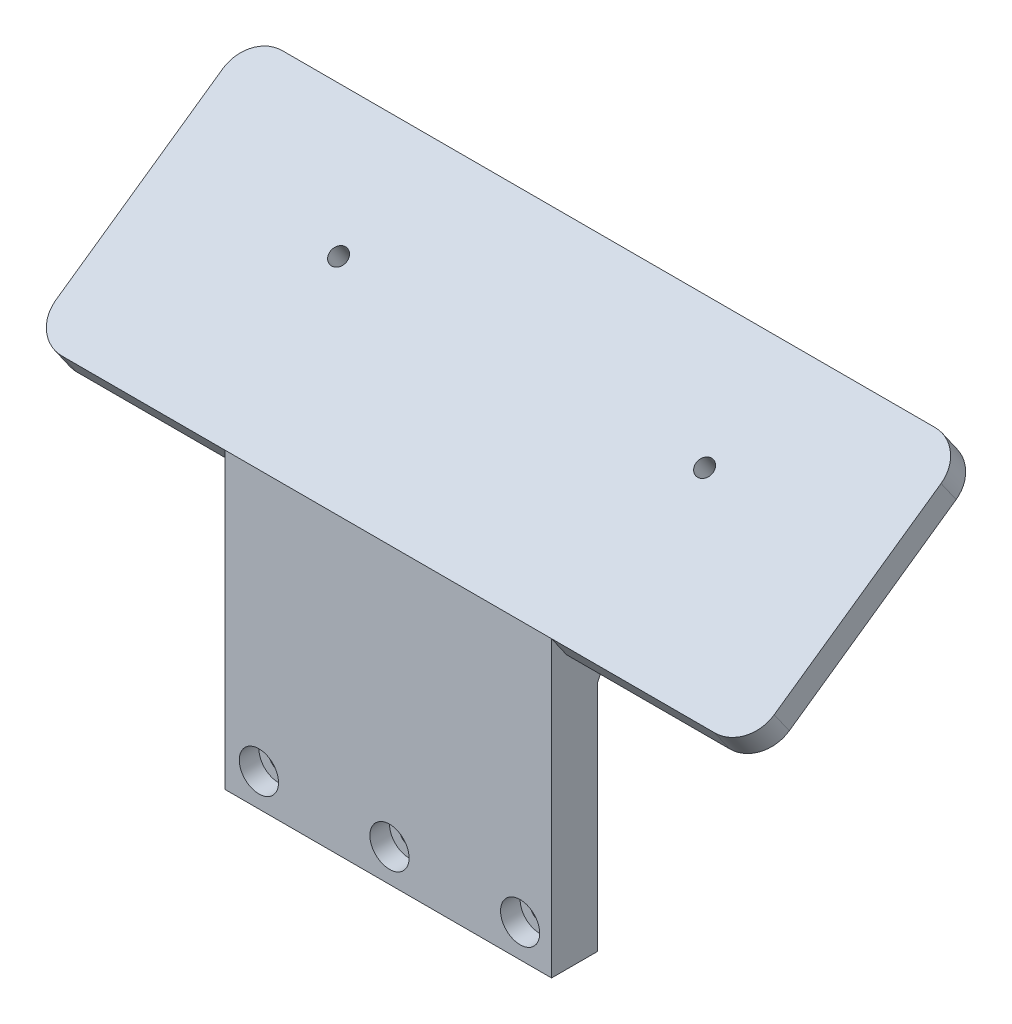
ISO-10303-21;
HEADER;
FILE_DESCRIPTION(('STEP AP214'),'2;1');
FILE_NAME('part.step','',(''),(''),'','','');
FILE_SCHEMA(('AUTOMOTIVE_DESIGN { 1 0 10303 214 1 1 1 1 }'));
ENDSEC;
DATA;
#1=APPLICATION_CONTEXT('core data for automotive mechanical design processes');
#2=APPLICATION_PROTOCOL_DEFINITION('international standard','automotive_design',2000,#1);
#3=PRODUCT_CONTEXT('',#1,'mechanical');
#4=PRODUCT('Part','Part','',(#3));
#5=PRODUCT_RELATED_PRODUCT_CATEGORY('part','',(#4));
#6=PRODUCT_DEFINITION_FORMATION('','',#4);
#7=PRODUCT_DEFINITION_CONTEXT('part definition',#1,'design');
#8=PRODUCT_DEFINITION('design','',#6,#7);
#9=PRODUCT_DEFINITION_SHAPE('','',#8);
#10=(LENGTH_UNIT() NAMED_UNIT(*) SI_UNIT(.MILLI.,.METRE.));
#11=(NAMED_UNIT(*) PLANE_ANGLE_UNIT() SI_UNIT($,.RADIAN.));
#12=(NAMED_UNIT(*) SI_UNIT($,.STERADIAN.) SOLID_ANGLE_UNIT());
#13=UNCERTAINTY_MEASURE_WITH_UNIT(LENGTH_MEASURE(1.E-05),#10,'distance_accuracy_value','');
#14=(GEOMETRIC_REPRESENTATION_CONTEXT(3) GLOBAL_UNCERTAINTY_ASSIGNED_CONTEXT((#13)) GLOBAL_UNIT_ASSIGNED_CONTEXT((#10,
#11,#12)) REPRESENTATION_CONTEXT('',''));
#15=CARTESIAN_POINT('',(0.,0.,0.));
#16=DIRECTION('',(0.,0.,1.));
#17=DIRECTION('',(1.,0.,0.));
#18=AXIS2_PLACEMENT_3D('',#15,#16,#17);
#19=CARTESIAN_POINT('',(0.,35.7869859354237,25.0583173217886));
#20=DIRECTION('',(0.,0.819152044288991,0.573576436351047));
#21=DIRECTION('',(0.,-0.573576436351047,0.819152044288991));
#22=AXIS2_PLACEMENT_3D('',#19,#20,#21);
#23=PLANE('',#22);
#24=CARTESIAN_POINT('',(-71.3751766055046,55.8736511521487,-3.62841356957319));
#25=DIRECTION('',(0.,0.819152044288991,0.573576436351047));
#26=DIRECTION('',(0.,-0.573576436351047,0.819152044288991));
#27=AXIS2_PLACEMENT_3D('',#24,#25,#26);
#28=CIRCLE('',#27,1.29999999999999);
#29=CARTESIAN_POINT('',(-71.3751766055046,55.1280017848923,-2.56351591199751));
#30=VERTEX_POINT('',#29);
#31=EDGE_CURVE('E177',#30,#30,#28,.T.);
#32=ORIENTED_EDGE('',*,*,#31,.T.);
#33=EDGE_LOOP('',(#32));
#34=FACE_BOUND('',#33,.T.);
#35=CARTESIAN_POINT('',(-15.3251766055046,55.8736511521487,-3.6284135695732));
#36=DIRECTION('',(0.,0.819152044288991,0.573576436351047));
#37=DIRECTION('',(0.,-0.573576436351047,0.819152044288991));
#38=AXIS2_PLACEMENT_3D('',#35,#36,#37);
#39=CIRCLE('',#38,1.3);
#40=CARTESIAN_POINT('',(-15.3251766055046,55.1280017848924,-2.56351591199751));
#41=VERTEX_POINT('',#40);
#42=EDGE_CURVE('E174',#41,#41,#39,.T.);
#43=ORIENTED_EDGE('',*,*,#42,.T.);
#44=EDGE_LOOP('',(#43));
#45=FACE_BOUND('',#44,.T.);
#46=DIRECTION('',(-1.,0.,0.));
#47=VECTOR('',#46,1.);
#48=CARTESIAN_POINT('',(0.,41.7110758272493,16.5978401510168));
#49=LINE('',#48,#47);
#50=CARTESIAN_POINT('',(-68.5342770663382,41.7110758272493,16.5978401510169));
#51=VERTEX_POINT('',#50);
#52=CARTESIAN_POINT('',(-93.5342770663382,41.7110758272493,16.5978401510169));
#53=VERTEX_POINT('',#52);
#54=EDGE_CURVE('E187',#51,#53,#49,.T.);
#55=ORIENTED_EDGE('',*,*,#54,.T.);
#56=CARTESIAN_POINT('',(-93.5342770663382,44.5789580090046,12.5020799295719));
#57=DIRECTION('',(0.,0.819152044288991,0.573576436351047));
#58=DIRECTION('',(0.,-0.573576436351047,0.819152044288991));
#59=AXIS2_PLACEMENT_3D('',#56,#57,#58);
#60=CIRCLE('',#59,5.);
#61=CARTESIAN_POINT('',(-98.5342770663382,44.5789580090046,12.5020799295719));
#62=VERTEX_POINT('',#61);
#63=EDGE_CURVE('E288',#53,#62,#60,.F.);
#64=ORIENTED_EDGE('',*,*,#63,.T.);
#65=DIRECTION('',(0.,0.573576436351047,-0.819152044288991));
#66=VECTOR('',#65,1.);
#67=CARTESIAN_POINT('',(-98.5342770663382,35.7869859354237,25.0583173217886));
#68=LINE('',#67,#66);
#69=CARTESIAN_POINT('',(-98.5342770663382,62.4697801701858,-13.0486620788966));
#70=VERTEX_POINT('',#69);
#71=EDGE_CURVE('E184',#62,#70,#68,.T.);
#72=ORIENTED_EDGE('',*,*,#71,.T.);
#73=CARTESIAN_POINT('',(-93.5342770663382,62.4697801701857,-13.0486620788966));
#74=DIRECTION('',(0.,0.819152044288991,0.573576436351047));
#75=DIRECTION('',(0.,-0.573576436351047,0.819152044288991));
#76=AXIS2_PLACEMENT_3D('',#73,#74,#75);
#77=CIRCLE('',#76,5.);
#78=CARTESIAN_POINT('',(-93.5342770663382,65.337662351941,-17.1444223003415));
#79=VERTEX_POINT('',#78);
#80=EDGE_CURVE('E283',#70,#79,#77,.F.);
#81=ORIENTED_EDGE('',*,*,#80,.T.);
#82=DIRECTION('',(1.,0.,0.));
#83=VECTOR('',#82,1.);
#84=CARTESIAN_POINT('',(0.,65.337662351941,-17.1444223003415));
#85=LINE('',#84,#83);
#86=CARTESIAN_POINT('',(6.4657229336618,65.337662351941,-17.1444223003415));
#87=VERTEX_POINT('',#86);
#88=EDGE_CURVE('E181',#79,#87,#85,.T.);
#89=ORIENTED_EDGE('',*,*,#88,.T.);
#90=CARTESIAN_POINT('',(6.4657229336618,62.4697801701857,-13.0486620788966));
#91=DIRECTION('',(0.,0.819152044288991,0.573576436351047));
#92=DIRECTION('',(0.,-0.573576436351047,0.819152044288991));
#93=AXIS2_PLACEMENT_3D('',#90,#91,#92);
#94=CIRCLE('',#93,5.);
#95=CARTESIAN_POINT('',(11.4657229336618,62.4697801701858,-13.0486620788966));
#96=VERTEX_POINT('',#95);
#97=EDGE_CURVE('E285',#87,#96,#94,.F.);
#98=ORIENTED_EDGE('',*,*,#97,.T.);
#99=DIRECTION('',(0.,-0.573576436351047,0.819152044288991));
#100=VECTOR('',#99,1.);
#101=CARTESIAN_POINT('',(11.4657229336618,35.7869859354237,25.0583173217886));
#102=LINE('',#101,#100);
#103=CARTESIAN_POINT('',(11.4657229336618,44.5789580090046,12.5020799295719));
#104=VERTEX_POINT('',#103);
#105=EDGE_CURVE('E190',#96,#104,#102,.T.);
#106=ORIENTED_EDGE('',*,*,#105,.T.);
#107=CARTESIAN_POINT('',(6.46572293366181,44.5789580090046,12.5020799295719));
#108=DIRECTION('',(0.,0.819152044288991,0.573576436351047));
#109=DIRECTION('',(0.,-0.573576436351047,0.819152044288991));
#110=AXIS2_PLACEMENT_3D('',#107,#108,#109);
#111=CIRCLE('',#110,5.);
#112=CARTESIAN_POINT('',(6.46572293366181,41.7110758272493,16.5978401510168));
#113=VERTEX_POINT('',#112);
#114=EDGE_CURVE('E57',#104,#113,#111,.F.);
#115=ORIENTED_EDGE('',*,*,#114,.T.);
#116=CARTESIAN_POINT('',(-18.5342770663382,41.7110758272493,16.5978401510169));
#117=VERTEX_POINT('',#116);
#118=EDGE_CURVE('E188',#113,#117,#49,.T.);
#119=ORIENTED_EDGE('',*,*,#118,.T.);
#120=DIRECTION('',(0.,0.573576436351047,-0.819152044288991));
#121=VECTOR('',#120,1.);
#122=CARTESIAN_POINT('',(-18.5342770663382,45.,11.900769649377));
#123=LINE('',#122,#121);
#124=CARTESIAN_POINT('',(-18.5342770663382,49.4042065965027,5.61091077730129));
#125=VERTEX_POINT('',#124);
#126=EDGE_CURVE('E156',#117,#125,#123,.T.);
#127=ORIENTED_EDGE('',*,*,#126,.T.);
#128=DIRECTION('',(1.,0.,0.));
#129=VECTOR('',#128,1.);
#130=CARTESIAN_POINT('',(-83.7624290800347,49.4042065965026,5.6109107773013));
#131=LINE('',#130,#129);
#132=CARTESIAN_POINT('',(-68.5342770663382,49.4042065965026,5.6109107773013));
#133=VERTEX_POINT('',#132);
#134=EDGE_CURVE('E159',#133,#125,#131,.T.);
#135=ORIENTED_EDGE('',*,*,#134,.F.);
#136=DIRECTION('',(0.,-0.573576436351047,0.819152044288991));
#137=VECTOR('',#136,1.);
#138=CARTESIAN_POINT('',(-68.5342770663382,41.7110758272493,16.5978401510169));
#139=LINE('',#138,#137);
#140=EDGE_CURVE('E144',#133,#51,#139,.T.);
#141=ORIENTED_EDGE('',*,*,#140,.T.);
#142=EDGE_LOOP('',(#55,#64,#72,#81,#89,#98,#106,#115,#119,#127,#135,#141));
#143=FACE_BOUND('',#142,.T.);
#144=ADVANCED_FACE('F42',(#34,#45,#143),#23,.F.);
#145=CARTESIAN_POINT('',(-68.5342770663382,45.,18.900769649377));
#146=DIRECTION('',(1.,0.,0.));
#147=DIRECTION('',(0.,0.,-1.));
#148=AXIS2_PLACEMENT_3D('',#145,#146,#147);
#149=PLANE('',#148);
#150=DIRECTION('',(0.,0.819152044288991,0.573576436351047));
#151=VECTOR('',#150,1.);
#152=CARTESIAN_POINT('',(-68.5342770663382,45.,18.900769649377));
#153=LINE('',#152,#151);
#154=CARTESIAN_POINT('',(-68.5342770663382,45.,18.900769649377));
#155=VERTEX_POINT('',#154);
#156=EDGE_CURVE('E152',#51,#155,#153,.T.);
#157=ORIENTED_EDGE('',*,*,#156,.F.);
#158=ORIENTED_EDGE('',*,*,#140,.F.);
#159=DIRECTION('',(0.,-0.910712200782229,0.413041508018732));
#160=VECTOR('',#159,1.);
#161=CARTESIAN_POINT('',(-68.5342770663382,49.4042065965026,5.6109107773013));
#162=LINE('',#161,#160);
#163=CARTESIAN_POINT('',(-68.5342770663382,35.5357427622627,11.900769649377));
#164=VERTEX_POINT('',#163);
#165=EDGE_CURVE('E148',#133,#164,#162,.T.);
#166=ORIENTED_EDGE('',*,*,#165,.T.);
#167=DIRECTION('',(0.,-1.,0.));
#168=VECTOR('',#167,1.);
#169=CARTESIAN_POINT('',(-68.5342770663382,45.,11.900769649377));
#170=LINE('',#169,#168);
#171=CARTESIAN_POINT('',(-68.5342770663382,0.,11.900769649377));
#172=VERTEX_POINT('',#171);
#173=EDGE_CURVE('E248',#164,#172,#170,.T.);
#174=ORIENTED_EDGE('',*,*,#173,.T.);
#175=DIRECTION('',(0.,0.,1.));
#176=VECTOR('',#175,1.);
#177=CARTESIAN_POINT('',(-68.5342770663382,0.,18.900769649377));
#178=LINE('',#177,#176);
#179=CARTESIAN_POINT('',(-68.5342770663382,0.,18.900769649377));
#180=VERTEX_POINT('',#179);
#181=EDGE_CURVE('E242',#172,#180,#178,.T.);
#182=ORIENTED_EDGE('',*,*,#181,.T.);
#183=DIRECTION('',(0.,-1.,0.));
#184=VECTOR('',#183,1.);
#185=CARTESIAN_POINT('',(-68.5342770663382,45.,18.900769649377));
#186=LINE('',#185,#184);
#187=EDGE_CURVE('E265',#155,#180,#186,.T.);
#188=ORIENTED_EDGE('',*,*,#187,.F.);
#189=EDGE_LOOP('',(#157,#158,#166,#174,#182,#188));
#190=FACE_BOUND('',#189,.T.);
#191=ADVANCED_FACE('F146',(#190),#149,.F.);
#192=CARTESIAN_POINT('',(-18.5342770663382,45.,11.900769649377));
#193=DIRECTION('',(-1.,0.,0.));
#194=DIRECTION('',(0.,0.,1.));
#195=AXIS2_PLACEMENT_3D('',#192,#193,#194);
#196=PLANE('',#195);
#197=DIRECTION('',(0.,-0.819152044288991,-0.573576436351047));
#198=VECTOR('',#197,1.);
#199=CARTESIAN_POINT('',(-18.5342770663382,41.7110758272493,16.5978401510168));
#200=LINE('',#199,#198);
#201=CARTESIAN_POINT('',(-18.5342770663382,45.,18.900769649377));
#202=VERTEX_POINT('',#201);
#203=EDGE_CURVE('E155',#202,#117,#200,.T.);
#204=ORIENTED_EDGE('',*,*,#203,.F.);
#205=DIRECTION('',(0.,-1.,0.));
#206=VECTOR('',#205,1.);
#207=CARTESIAN_POINT('',(-18.5342770663382,45.,18.900769649377));
#208=LINE('',#207,#206);
#209=CARTESIAN_POINT('',(-18.5342770663382,0.,18.900769649377));
#210=VERTEX_POINT('',#209);
#211=EDGE_CURVE('E262',#202,#210,#208,.T.);
#212=ORIENTED_EDGE('',*,*,#211,.T.);
#213=DIRECTION('',(0.,0.,-1.));
#214=VECTOR('',#213,1.);
#215=CARTESIAN_POINT('',(-18.5342770663382,0.,11.900769649377));
#216=LINE('',#215,#214);
#217=CARTESIAN_POINT('',(-18.5342770663382,0.,11.900769649377));
#218=VERTEX_POINT('',#217);
#219=EDGE_CURVE('E254',#210,#218,#216,.T.);
#220=ORIENTED_EDGE('',*,*,#219,.T.);
#221=DIRECTION('',(0.,-1.,0.));
#222=VECTOR('',#221,1.);
#223=CARTESIAN_POINT('',(-18.5342770663382,45.,11.900769649377));
#224=LINE('',#223,#222);
#225=CARTESIAN_POINT('',(-18.5342770663382,35.5357427622627,11.900769649377));
#226=VERTEX_POINT('',#225);
#227=EDGE_CURVE('E260',#226,#218,#224,.T.);
#228=ORIENTED_EDGE('',*,*,#227,.F.);
#229=DIRECTION('',(0.,0.910712200782229,-0.413041508018732));
#230=VECTOR('',#229,1.);
#231=CARTESIAN_POINT('',(-18.5342770663382,49.4042065965026,5.6109107773013));
#232=LINE('',#231,#230);
#233=EDGE_CURVE('E625',#226,#125,#232,.T.);
#234=ORIENTED_EDGE('',*,*,#233,.T.);
#235=ORIENTED_EDGE('',*,*,#126,.F.);
#236=EDGE_LOOP('',(#204,#212,#220,#228,#234,#235));
#237=FACE_BOUND('',#236,.T.);
#238=ADVANCED_FACE('F350',(#237),#196,.F.);
#239=CARTESIAN_POINT('',(-18.5342770663382,45.,18.900769649377));
#240=DIRECTION('',(0.,0.,-1.));
#241=DIRECTION('',(-1.,0.,0.));
#242=AXIS2_PLACEMENT_3D('',#239,#240,#241);
#243=PLANE('',#242);
#244=CARTESIAN_POINT('',(-63.3501766055046,5.,18.900769649377));
#245=DIRECTION('',(0.,0.,1.));
#246=DIRECTION('',(1.,0.,0.));
#247=AXIS2_PLACEMENT_3D('',#244,#245,#246);
#248=CIRCLE('',#247,3.);
#249=CARTESIAN_POINT('',(-60.3501766055046,5.,18.900769649377));
#250=VERTEX_POINT('',#249);
#251=EDGE_CURVE('E234',#250,#250,#248,.T.);
#252=ORIENTED_EDGE('',*,*,#251,.F.);
#253=EDGE_LOOP('',(#252));
#254=FACE_BOUND('',#253,.T.);
#255=CARTESIAN_POINT('',(-23.3501766055046,5.,18.900769649377));
#256=DIRECTION('',(0.,0.,1.));
#257=DIRECTION('',(1.,0.,0.));
#258=AXIS2_PLACEMENT_3D('',#255,#256,#257);
#259=CIRCLE('',#258,2.99999999999999);
#260=CARTESIAN_POINT('',(-20.3501766055046,5.,18.900769649377));
#261=VERTEX_POINT('',#260);
#262=EDGE_CURVE('E227',#261,#261,#259,.T.);
#263=ORIENTED_EDGE('',*,*,#262,.F.);
#264=EDGE_LOOP('',(#263));
#265=FACE_BOUND('',#264,.T.);
#266=CARTESIAN_POINT('',(-43.3501766055046,5.,18.900769649377));
#267=DIRECTION('',(0.,0.,1.));
#268=DIRECTION('',(1.,0.,0.));
#269=AXIS2_PLACEMENT_3D('',#266,#267,#268);
#270=CIRCLE('',#269,3.);
#271=CARTESIAN_POINT('',(-40.3501766055046,5.,18.900769649377));
#272=VERTEX_POINT('',#271);
#273=EDGE_CURVE('E230',#272,#272,#270,.T.);
#274=ORIENTED_EDGE('',*,*,#273,.F.);
#275=EDGE_LOOP('',(#274));
#276=FACE_BOUND('',#275,.T.);
#277=DIRECTION('',(1.,0.,0.));
#278=VECTOR('',#277,1.);
#279=CARTESIAN_POINT('',(-18.5342770663382,0.,18.900769649377));
#280=LINE('',#279,#278);
#281=EDGE_CURVE('E252',#180,#210,#280,.T.);
#282=ORIENTED_EDGE('',*,*,#281,.T.);
#283=ORIENTED_EDGE('',*,*,#211,.F.);
#284=DIRECTION('',(1.,0.,0.));
#285=VECTOR('',#284,1.);
#286=CARTESIAN_POINT('',(-18.5342770663382,45.,18.900769649377));
#287=LINE('',#286,#285);
#288=EDGE_CURVE('E245',#155,#202,#287,.T.);
#289=ORIENTED_EDGE('',*,*,#288,.F.);
#290=ORIENTED_EDGE('',*,*,#187,.T.);
#291=EDGE_LOOP('',(#282,#283,#289,#290));
#292=FACE_BOUND('',#291,.T.);
#293=ADVANCED_FACE('F324',(#254,#265,#276,#292),#243,.F.);
#294=CARTESIAN_POINT('',(-68.5342770663382,45.,11.900769649377));
#295=DIRECTION('',(0.,0.,1.));
#296=DIRECTION('',(1.,0.,0.));
#297=AXIS2_PLACEMENT_3D('',#294,#295,#296);
#298=PLANE('',#297);
#299=CARTESIAN_POINT('',(-23.3501766055046,5.,11.900769649377));
#300=DIRECTION('',(0.,0.,1.));
#301=DIRECTION('',(1.,0.,0.));
#302=AXIS2_PLACEMENT_3D('',#299,#300,#301);
#303=CIRCLE('',#302,1.4);
#304=CARTESIAN_POINT('',(-21.9501766055046,5.,11.900769649377));
#305=VERTEX_POINT('',#304);
#306=EDGE_CURVE('E209',#305,#305,#303,.T.);
#307=ORIENTED_EDGE('',*,*,#306,.T.);
#308=EDGE_LOOP('',(#307));
#309=FACE_BOUND('',#308,.T.);
#310=CARTESIAN_POINT('',(-43.3501766055046,5.,11.900769649377));
#311=DIRECTION('',(0.,0.,1.));
#312=DIRECTION('',(1.,0.,0.));
#313=AXIS2_PLACEMENT_3D('',#310,#311,#312);
#314=CIRCLE('',#313,1.4);
#315=CARTESIAN_POINT('',(-41.9501766055046,5.,11.900769649377));
#316=VERTEX_POINT('',#315);
#317=EDGE_CURVE('E219',#316,#316,#314,.T.);
#318=ORIENTED_EDGE('',*,*,#317,.T.);
#319=EDGE_LOOP('',(#318));
#320=FACE_BOUND('',#319,.T.);
#321=CARTESIAN_POINT('',(-63.3501766055046,5.,11.900769649377));
#322=DIRECTION('',(0.,0.,1.));
#323=DIRECTION('',(1.,0.,0.));
#324=AXIS2_PLACEMENT_3D('',#321,#322,#323);
#325=CIRCLE('',#324,1.4);
#326=CARTESIAN_POINT('',(-61.9501766055046,5.,11.900769649377));
#327=VERTEX_POINT('',#326);
#328=EDGE_CURVE('E208',#327,#327,#325,.T.);
#329=ORIENTED_EDGE('',*,*,#328,.T.);
#330=EDGE_LOOP('',(#329));
#331=FACE_BOUND('',#330,.T.);
#332=ORIENTED_EDGE('',*,*,#173,.F.);
#333=DIRECTION('',(1.,0.,0.));
#334=VECTOR('',#333,1.);
#335=CARTESIAN_POINT('',(-83.7624290800347,35.5357427622627,11.900769649377));
#336=LINE('',#335,#334);
#337=EDGE_CURVE('E164',#164,#226,#336,.T.);
#338=ORIENTED_EDGE('',*,*,#337,.T.);
#339=ORIENTED_EDGE('',*,*,#227,.T.);
#340=DIRECTION('',(-1.,0.,0.));
#341=VECTOR('',#340,1.);
#342=CARTESIAN_POINT('',(-68.5342770663382,0.,11.900769649377));
#343=LINE('',#342,#341);
#344=EDGE_CURVE('E249',#218,#172,#343,.T.);
#345=ORIENTED_EDGE('',*,*,#344,.T.);
#346=EDGE_LOOP('',(#332,#338,#339,#345));
#347=FACE_BOUND('',#346,.T.);
#348=ADVANCED_FACE('F412',(#309,#320,#331,#347),#298,.F.);
#349=CARTESIAN_POINT('',(0.,0.,0.));
#350=DIRECTION('',(0.,-1.,0.));
#351=DIRECTION('',(0.,0.,-1.));
#352=AXIS2_PLACEMENT_3D('',#349,#350,#351);
#353=PLANE('',#352);
#354=ORIENTED_EDGE('',*,*,#181,.F.);
#355=ORIENTED_EDGE('',*,*,#344,.F.);
#356=ORIENTED_EDGE('',*,*,#219,.F.);
#357=ORIENTED_EDGE('',*,*,#281,.F.);
#358=EDGE_LOOP('',(#354,#355,#356,#357));
#359=FACE_BOUND('',#358,.T.);
#360=ADVANCED_FACE('F408',(#359),#353,.T.);
#361=CARTESIAN_POINT('',(-43.3501766055046,5.,15.900769649377));
#362=DIRECTION('',(0.,0.,1.));
#363=DIRECTION('',(1.,0.,0.));
#364=AXIS2_PLACEMENT_3D('',#361,#362,#363);
#365=CYLINDRICAL_SURFACE('',#364,3.);
#366=CARTESIAN_POINT('',(-43.3501766055046,5.,15.900769649377));
#367=DIRECTION('',(0.,0.,1.));
#368=DIRECTION('',(1.,0.,0.));
#369=AXIS2_PLACEMENT_3D('',#366,#367,#368);
#370=CIRCLE('',#369,3.);
#371=CARTESIAN_POINT('',(-40.3501766055046,5.,15.900769649377));
#372=VERTEX_POINT('',#371);
#373=EDGE_CURVE('E239',#372,#372,#370,.T.);
#374=ORIENTED_EDGE('',*,*,#373,.F.);
#375=EDGE_LOOP('',(#374));
#376=FACE_BOUND('',#375,.T.);
#377=ORIENTED_EDGE('',*,*,#273,.T.);
#378=EDGE_LOOP('',(#377));
#379=FACE_BOUND('',#378,.T.);
#380=ADVANCED_FACE('F404',(#376,#379),#365,.F.);
#381=CARTESIAN_POINT('',(-43.3501766055046,5.,15.900769649377));
#382=DIRECTION('',(0.,0.,1.));
#383=DIRECTION('',(1.,0.,0.));
#384=AXIS2_PLACEMENT_3D('',#381,#382,#383);
#385=PLANE('',#384);
#386=CARTESIAN_POINT('',(-43.3501766055046,5.,15.900769649377));
#387=DIRECTION('',(0.,0.,1.));
#388=DIRECTION('',(1.,0.,0.));
#389=AXIS2_PLACEMENT_3D('',#386,#387,#388);
#390=CIRCLE('',#389,1.4);
#391=CARTESIAN_POINT('',(-41.9501766055046,5.,15.900769649377));
#392=VERTEX_POINT('',#391);
#393=EDGE_CURVE('E216',#392,#392,#390,.T.);
#394=ORIENTED_EDGE('',*,*,#393,.F.);
#395=EDGE_LOOP('',(#394));
#396=FACE_BOUND('',#395,.T.);
#397=ORIENTED_EDGE('',*,*,#373,.T.);
#398=EDGE_LOOP('',(#397));
#399=FACE_BOUND('',#398,.T.);
#400=ADVANCED_FACE('F390',(#396,#399),#385,.T.);
#401=CARTESIAN_POINT('',(-23.3501766055046,5.,15.900769649377));
#402=DIRECTION('',(0.,0.,1.));
#403=DIRECTION('',(1.,0.,0.));
#404=AXIS2_PLACEMENT_3D('',#401,#402,#403);
#405=CYLINDRICAL_SURFACE('',#404,2.99999999999999);
#406=CARTESIAN_POINT('',(-23.3501766055046,5.,15.900769649377));
#407=DIRECTION('',(0.,0.,1.));
#408=DIRECTION('',(1.,0.,0.));
#409=AXIS2_PLACEMENT_3D('',#406,#407,#408);
#410=CIRCLE('',#409,2.99999999999999);
#411=CARTESIAN_POINT('',(-20.3501766055046,5.,15.900769649377));
#412=VERTEX_POINT('',#411);
#413=EDGE_CURVE('E231',#412,#412,#410,.T.);
#414=ORIENTED_EDGE('',*,*,#413,.F.);
#415=EDGE_LOOP('',(#414));
#416=FACE_BOUND('',#415,.T.);
#417=ORIENTED_EDGE('',*,*,#262,.T.);
#418=EDGE_LOOP('',(#417));
#419=FACE_BOUND('',#418,.T.);
#420=ADVANCED_FACE('F386',(#416,#419),#405,.F.);
#421=CARTESIAN_POINT('',(-23.3501766055046,5.,15.900769649377));
#422=DIRECTION('',(0.,0.,1.));
#423=DIRECTION('',(1.,0.,0.));
#424=AXIS2_PLACEMENT_3D('',#421,#422,#423);
#425=PLANE('',#424);
#426=CARTESIAN_POINT('',(-23.3501766055046,5.,15.900769649377));
#427=DIRECTION('',(0.,0.,1.));
#428=DIRECTION('',(1.,0.,0.));
#429=AXIS2_PLACEMENT_3D('',#426,#427,#428);
#430=CIRCLE('',#429,1.4);
#431=CARTESIAN_POINT('',(-21.9501766055046,5.,15.900769649377));
#432=VERTEX_POINT('',#431);
#433=EDGE_CURVE('E213',#432,#432,#430,.T.);
#434=ORIENTED_EDGE('',*,*,#433,.F.);
#435=EDGE_LOOP('',(#434));
#436=FACE_BOUND('',#435,.T.);
#437=ORIENTED_EDGE('',*,*,#413,.T.);
#438=EDGE_LOOP('',(#437));
#439=FACE_BOUND('',#438,.T.);
#440=ADVANCED_FACE('F389',(#436,#439),#425,.T.);
#441=CARTESIAN_POINT('',(-63.3501766055046,5.,15.900769649377));
#442=DIRECTION('',(0.,0.,1.));
#443=DIRECTION('',(1.,0.,0.));
#444=AXIS2_PLACEMENT_3D('',#441,#442,#443);
#445=CYLINDRICAL_SURFACE('',#444,3.);
#446=CARTESIAN_POINT('',(-63.3501766055046,5.,15.900769649377));
#447=DIRECTION('',(0.,0.,1.));
#448=DIRECTION('',(1.,0.,0.));
#449=AXIS2_PLACEMENT_3D('',#446,#447,#448);
#450=CIRCLE('',#449,3.);
#451=CARTESIAN_POINT('',(-60.3501766055046,5.,15.900769649377));
#452=VERTEX_POINT('',#451);
#453=EDGE_CURVE('E212',#452,#452,#450,.T.);
#454=ORIENTED_EDGE('',*,*,#453,.F.);
#455=EDGE_LOOP('',(#454));
#456=FACE_BOUND('',#455,.T.);
#457=ORIENTED_EDGE('',*,*,#251,.T.);
#458=EDGE_LOOP('',(#457));
#459=FACE_BOUND('',#458,.T.);
#460=ADVANCED_FACE('F394',(#456,#459),#445,.F.);
#461=CARTESIAN_POINT('',(-63.3501766055046,5.,15.900769649377));
#462=DIRECTION('',(0.,0.,1.));
#463=DIRECTION('',(1.,0.,0.));
#464=AXIS2_PLACEMENT_3D('',#461,#462,#463);
#465=PLANE('',#464);
#466=CARTESIAN_POINT('',(-63.3501766055046,5.,15.900769649377));
#467=DIRECTION('',(0.,0.,1.));
#468=DIRECTION('',(1.,0.,0.));
#469=AXIS2_PLACEMENT_3D('',#466,#467,#468);
#470=CIRCLE('',#469,1.4);
#471=CARTESIAN_POINT('',(-61.9501766055046,5.,15.900769649377));
#472=VERTEX_POINT('',#471);
#473=EDGE_CURVE('E222',#472,#472,#470,.T.);
#474=ORIENTED_EDGE('',*,*,#473,.F.);
#475=EDGE_LOOP('',(#474));
#476=FACE_BOUND('',#475,.T.);
#477=ORIENTED_EDGE('',*,*,#453,.T.);
#478=EDGE_LOOP('',(#477));
#479=FACE_BOUND('',#478,.T.);
#480=ADVANCED_FACE('F384',(#476,#479),#465,.T.);
#481=CARTESIAN_POINT('',(-63.3501766055046,5.,11.900769649377));
#482=DIRECTION('',(0.,0.,1.));
#483=DIRECTION('',(1.,0.,0.));
#484=AXIS2_PLACEMENT_3D('',#481,#482,#483);
#485=CYLINDRICAL_SURFACE('',#484,1.4);
#486=ORIENTED_EDGE('',*,*,#328,.F.);
#487=EDGE_LOOP('',(#486));
#488=FACE_BOUND('',#487,.T.);
#489=ORIENTED_EDGE('',*,*,#473,.T.);
#490=EDGE_LOOP('',(#489));
#491=FACE_BOUND('',#490,.T.);
#492=ADVANCED_FACE('F380',(#488,#491),#485,.F.);
#493=CARTESIAN_POINT('',(-43.3501766055046,5.,11.900769649377));
#494=DIRECTION('',(0.,0.,1.));
#495=DIRECTION('',(1.,0.,0.));
#496=AXIS2_PLACEMENT_3D('',#493,#494,#495);
#497=CYLINDRICAL_SURFACE('',#496,1.4);
#498=ORIENTED_EDGE('',*,*,#317,.F.);
#499=EDGE_LOOP('',(#498));
#500=FACE_BOUND('',#499,.T.);
#501=ORIENTED_EDGE('',*,*,#393,.T.);
#502=EDGE_LOOP('',(#501));
#503=FACE_BOUND('',#502,.T.);
#504=ADVANCED_FACE('F376',(#500,#503),#497,.F.);
#505=CARTESIAN_POINT('',(-23.3501766055046,5.,11.900769649377));
#506=DIRECTION('',(0.,0.,1.));
#507=DIRECTION('',(1.,0.,0.));
#508=AXIS2_PLACEMENT_3D('',#505,#506,#507);
#509=CYLINDRICAL_SURFACE('',#508,1.4);
#510=ORIENTED_EDGE('',*,*,#306,.F.);
#511=EDGE_LOOP('',(#510));
#512=FACE_BOUND('',#511,.T.);
#513=ORIENTED_EDGE('',*,*,#433,.T.);
#514=EDGE_LOOP('',(#513));
#515=FACE_BOUND('',#514,.T.);
#516=ADVANCED_FACE('F362',(#512,#515),#509,.F.);
#517=CARTESIAN_POINT('',(0.,41.7110758272493,16.5978401510168));
#518=DIRECTION('',(0.,0.573576436351047,-0.819152044288991));
#519=DIRECTION('',(0.,0.819152044288991,0.573576436351047));
#520=AXIS2_PLACEMENT_3D('',#517,#518,#519);
#521=PLANE('',#520);
#522=DIRECTION('',(-1.,0.,0.));
#523=VECTOR('',#522,1.);
#524=CARTESIAN_POINT('',(0.,45.,18.900769649377));
#525=LINE('',#524,#523);
#526=CARTESIAN_POINT('',(-93.5342770663382,45.,18.900769649377));
#527=VERTEX_POINT('',#526);
#528=EDGE_CURVE('E200',#155,#527,#525,.T.);
#529=ORIENTED_EDGE('',*,*,#528,.T.);
#530=DIRECTION('',(0.,0.819152044288991,0.573576436351047));
#531=VECTOR('',#530,1.);
#532=CARTESIAN_POINT('',(-93.5342770663382,41.7110758272493,16.5978401510169));
#533=LINE('',#532,#531);
#534=EDGE_CURVE('E281',#527,#53,#533,.F.);
#535=ORIENTED_EDGE('',*,*,#534,.T.);
#536=ORIENTED_EDGE('',*,*,#54,.F.);
#537=ORIENTED_EDGE('',*,*,#156,.T.);
#538=EDGE_LOOP('',(#529,#535,#536,#537));
#539=FACE_BOUND('',#538,.T.);
#540=ADVANCED_FACE('F328',(#539),#521,.F.);
#541=ORIENTED_EDGE('',*,*,#118,.F.);
#542=DIRECTION('',(0.,0.819152044288991,0.573576436351047));
#543=VECTOR('',#542,1.);
#544=CARTESIAN_POINT('',(6.46572293366181,41.7110758272493,16.5978401510168));
#545=LINE('',#544,#543);
#546=CARTESIAN_POINT('',(6.46572293366181,45.,18.900769649377));
#547=VERTEX_POINT('',#546);
#548=EDGE_CURVE('E290',#113,#547,#545,.T.);
#549=ORIENTED_EDGE('',*,*,#548,.T.);
#550=EDGE_CURVE('E201',#547,#202,#525,.T.);
#551=ORIENTED_EDGE('',*,*,#550,.T.);
#552=ORIENTED_EDGE('',*,*,#203,.T.);
#553=EDGE_LOOP('',(#541,#549,#551,#552));
#554=FACE_BOUND('',#553,.T.);
#555=ADVANCED_FACE('F319',(#554),#521,.F.);
#556=CARTESIAN_POINT('',(0.,65.337662351941,-17.1444223003415));
#557=DIRECTION('',(0.,-0.573576436351047,0.819152044288991));
#558=DIRECTION('',(0.,-0.819152044288991,-0.573576436351047));
#559=AXIS2_PLACEMENT_3D('',#556,#557,#558);
#560=PLANE('',#559);
#561=DIRECTION('',(1.,0.,0.));
#562=VECTOR('',#561,1.);
#563=CARTESIAN_POINT('',(0.,68.6265865246917,-14.8414928019814));
#564=LINE('',#563,#562);
#565=CARTESIAN_POINT('',(-93.5342770663382,68.6265865246917,-14.8414928019814));
#566=VERTEX_POINT('',#565);
#567=CARTESIAN_POINT('',(6.4657229336618,68.6265865246917,-14.8414928019814));
#568=VERTEX_POINT('',#567);
#569=EDGE_CURVE('E194',#566,#568,#564,.T.);
#570=ORIENTED_EDGE('',*,*,#569,.T.);
#571=DIRECTION('',(0.,0.819152044288991,0.573576436351047));
#572=VECTOR('',#571,1.);
#573=CARTESIAN_POINT('',(6.4657229336618,65.337662351941,-17.1444223003415));
#574=LINE('',#573,#572);
#575=EDGE_CURVE('E11',#568,#87,#574,.F.);
#576=ORIENTED_EDGE('',*,*,#575,.T.);
#577=ORIENTED_EDGE('',*,*,#88,.F.);
#578=DIRECTION('',(0.,0.819152044288991,0.573576436351047));
#579=VECTOR('',#578,1.);
#580=CARTESIAN_POINT('',(-93.5342770663382,65.337662351941,-17.1444223003415));
#581=LINE('',#580,#579);
#582=EDGE_CURVE('E50',#79,#566,#581,.T.);
#583=ORIENTED_EDGE('',*,*,#582,.T.);
#584=EDGE_LOOP('',(#570,#576,#577,#583));
#585=FACE_BOUND('',#584,.T.);
#586=ADVANCED_FACE('F301',(#585),#560,.F.);
#587=CARTESIAN_POINT('',(11.4657229336618,35.7869859354237,25.0583173217886));
#588=DIRECTION('',(-1.,0.,0.));
#589=DIRECTION('',(0.,0.,1.));
#590=AXIS2_PLACEMENT_3D('',#587,#588,#589);
#591=PLANE('',#590);
#592=DIRECTION('',(0.,-0.573576436351047,0.819152044288991));
#593=VECTOR('',#592,1.);
#594=CARTESIAN_POINT('',(11.4657229336618,39.0759101081744,27.3612468201488));
#595=LINE('',#594,#593);
#596=CARTESIAN_POINT('',(11.4657229336618,65.7587043429364,-10.7457325805364));
#597=VERTEX_POINT('',#596);
#598=CARTESIAN_POINT('',(11.4657229336618,47.8678821817552,14.805009427932));
#599=VERTEX_POINT('',#598);
#600=EDGE_CURVE('E178',#597,#599,#595,.T.);
#601=ORIENTED_EDGE('',*,*,#600,.T.);
#602=DIRECTION('',(0.,0.819152044288991,0.573576436351047));
#603=VECTOR('',#602,1.);
#604=CARTESIAN_POINT('',(11.4657229336618,44.5789580090046,12.5020799295719));
#605=LINE('',#604,#603);
#606=EDGE_CURVE('E65',#599,#104,#605,.F.);
#607=ORIENTED_EDGE('',*,*,#606,.T.);
#608=ORIENTED_EDGE('',*,*,#105,.F.);
#609=DIRECTION('',(0.,0.819152044288991,0.573576436351047));
#610=VECTOR('',#609,1.);
#611=CARTESIAN_POINT('',(11.4657229336618,62.4697801701857,-13.0486620788966));
#612=LINE('',#611,#610);
#613=EDGE_CURVE('E293',#96,#597,#612,.T.);
#614=ORIENTED_EDGE('',*,*,#613,.T.);
#615=EDGE_LOOP('',(#601,#607,#608,#614));
#616=FACE_BOUND('',#615,.T.);
#617=ADVANCED_FACE('F313',(#616),#591,.F.);
#618=CARTESIAN_POINT('',(-71.3751766055046,55.8736511521487,-3.62841356957319));
#619=DIRECTION('',(0.,0.819152044288991,0.573576436351047));
#620=DIRECTION('',(0.,-0.573576436351047,0.819152044288991));
#621=AXIS2_PLACEMENT_3D('',#618,#619,#620);
#622=CYLINDRICAL_SURFACE('',#621,1.29999999999999);
#623=ORIENTED_EDGE('',*,*,#31,.F.);
#624=EDGE_LOOP('',(#623));
#625=FACE_BOUND('',#624,.T.);
#626=CARTESIAN_POINT('',(-71.3751766055046,59.1625753248994,-1.32548407121302));
#627=DIRECTION('',(0.,0.819152044288991,0.573576436351047));
#628=DIRECTION('',(0.,-0.573576436351047,0.819152044288991));
#629=AXIS2_PLACEMENT_3D('',#626,#627,#628);
#630=CIRCLE('',#629,1.29999999999999);
#631=CARTESIAN_POINT('',(-71.3751766055046,58.416925957643,-0.26058641363734));
#632=VERTEX_POINT('',#631);
#633=EDGE_CURVE('E170',#632,#632,#630,.T.);
#634=ORIENTED_EDGE('',*,*,#633,.T.);
#635=EDGE_LOOP('',(#634));
#636=FACE_BOUND('',#635,.T.);
#637=ADVANCED_FACE('F360',(#625,#636),#622,.F.);
#638=CARTESIAN_POINT('',(-15.3251766055046,55.8736511521487,-3.6284135695732));
#639=DIRECTION('',(0.,0.819152044288991,0.573576436351047));
#640=DIRECTION('',(0.,-0.573576436351047,0.819152044288991));
#641=AXIS2_PLACEMENT_3D('',#638,#639,#640);
#642=CYLINDRICAL_SURFACE('',#641,1.3);
#643=ORIENTED_EDGE('',*,*,#42,.F.);
#644=EDGE_LOOP('',(#643));
#645=FACE_BOUND('',#644,.T.);
#646=CARTESIAN_POINT('',(-15.3251766055046,59.1625753248994,-1.32548407121303));
#647=DIRECTION('',(0.,0.819152044288991,0.573576436351047));
#648=DIRECTION('',(0.,-0.573576436351047,0.819152044288991));
#649=AXIS2_PLACEMENT_3D('',#646,#647,#648);
#650=CIRCLE('',#649,1.3);
#651=CARTESIAN_POINT('',(-15.3251766055046,58.416925957643,-0.260586413637342));
#652=VERTEX_POINT('',#651);
#653=EDGE_CURVE('E167',#652,#652,#650,.T.);
#654=ORIENTED_EDGE('',*,*,#653,.T.);
#655=EDGE_LOOP('',(#654));
#656=FACE_BOUND('',#655,.T.);
#657=ADVANCED_FACE('F365',(#645,#656),#642,.F.);
#658=CARTESIAN_POINT('',(-98.5342770663382,35.7869859354237,25.0583173217886));
#659=DIRECTION('',(1.,0.,0.));
#660=DIRECTION('',(0.,1.,0.));
#661=AXIS2_PLACEMENT_3D('',#658,#659,#660);
#662=PLANE('',#661);
#663=ORIENTED_EDGE('',*,*,#71,.F.);
#664=DIRECTION('',(0.,0.819152044288991,0.573576436351047));
#665=VECTOR('',#664,1.);
#666=CARTESIAN_POINT('',(-98.5342770663382,44.5789580090046,12.5020799295719));
#667=LINE('',#666,#665);
#668=CARTESIAN_POINT('',(-98.5342770663382,47.8678821817552,14.8050094279321));
#669=VERTEX_POINT('',#668);
#670=EDGE_CURVE('E270',#62,#669,#667,.T.);
#671=ORIENTED_EDGE('',*,*,#670,.T.);
#672=DIRECTION('',(0.,0.573576436351047,-0.819152044288991));
#673=VECTOR('',#672,1.);
#674=CARTESIAN_POINT('',(-98.5342770663382,39.0759101081744,27.3612468201488));
#675=LINE('',#674,#673);
#676=CARTESIAN_POINT('',(-98.5342770663382,65.7587043429364,-10.7457325805364));
#677=VERTEX_POINT('',#676);
#678=EDGE_CURVE('E197',#669,#677,#675,.T.);
#679=ORIENTED_EDGE('',*,*,#678,.T.);
#680=DIRECTION('',(0.,0.819152044288991,0.573576436351047));
#681=VECTOR('',#680,1.);
#682=CARTESIAN_POINT('',(-98.5342770663382,62.4697801701857,-13.0486620788966));
#683=LINE('',#682,#681);
#684=EDGE_CURVE('E268',#677,#70,#683,.F.);
#685=ORIENTED_EDGE('',*,*,#684,.T.);
#686=EDGE_LOOP('',(#663,#671,#679,#685));
#687=FACE_BOUND('',#686,.T.);
#688=ADVANCED_FACE('F336',(#687),#662,.F.);
#689=CARTESIAN_POINT('',(0.,39.0759101081744,27.3612468201488));
#690=DIRECTION('',(0.,0.819152044288991,0.573576436351047));
#691=DIRECTION('',(0.,-0.573576436351047,0.819152044288991));
#692=AXIS2_PLACEMENT_3D('',#689,#690,#691);
#693=PLANE('',#692);
#694=ORIENTED_EDGE('',*,*,#653,.F.);
#695=EDGE_LOOP('',(#694));
#696=FACE_BOUND('',#695,.T.);
#697=ORIENTED_EDGE('',*,*,#633,.F.);
#698=EDGE_LOOP('',(#697));
#699=FACE_BOUND('',#698,.T.);
#700=ORIENTED_EDGE('',*,*,#678,.F.);
#701=CARTESIAN_POINT('',(-93.5342770663382,47.8678821817552,14.8050094279321));
#702=DIRECTION('',(0.,0.819152044288991,0.573576436351047));
#703=DIRECTION('',(0.,-0.573576436351047,0.819152044288991));
#704=AXIS2_PLACEMENT_3D('',#701,#702,#703);
#705=CIRCLE('',#704,5.);
#706=EDGE_CURVE('E279',#669,#527,#705,.T.);
#707=ORIENTED_EDGE('',*,*,#706,.T.);
#708=ORIENTED_EDGE('',*,*,#528,.F.);
#709=ORIENTED_EDGE('',*,*,#288,.T.);
#710=ORIENTED_EDGE('',*,*,#550,.F.);
#711=CARTESIAN_POINT('',(6.46572293366181,47.8678821817552,14.805009427932));
#712=DIRECTION('',(0.,0.819152044288991,0.573576436351047));
#713=DIRECTION('',(0.,-0.573576436351047,0.819152044288991));
#714=AXIS2_PLACEMENT_3D('',#711,#712,#713);
#715=CIRCLE('',#714,5.);
#716=EDGE_CURVE('E277',#547,#599,#715,.T.);
#717=ORIENTED_EDGE('',*,*,#716,.T.);
#718=ORIENTED_EDGE('',*,*,#600,.F.);
#719=CARTESIAN_POINT('',(6.4657229336618,65.7587043429364,-10.7457325805364));
#720=DIRECTION('',(0.,0.819152044288991,0.573576436351047));
#721=DIRECTION('',(0.,-0.573576436351047,0.819152044288991));
#722=AXIS2_PLACEMENT_3D('',#719,#720,#721);
#723=CIRCLE('',#722,5.);
#724=EDGE_CURVE('E275',#597,#568,#723,.T.);
#725=ORIENTED_EDGE('',*,*,#724,.T.);
#726=ORIENTED_EDGE('',*,*,#569,.F.);
#727=CARTESIAN_POINT('',(-93.5342770663382,65.7587043429364,-10.7457325805364));
#728=DIRECTION('',(0.,0.819152044288991,0.573576436351047));
#729=DIRECTION('',(0.,-0.573576436351047,0.819152044288991));
#730=AXIS2_PLACEMENT_3D('',#727,#728,#729);
#731=CIRCLE('',#730,5.);
#732=EDGE_CURVE('E273',#566,#677,#731,.T.);
#733=ORIENTED_EDGE('',*,*,#732,.T.);
#734=EDGE_LOOP('',(#700,#707,#708,#709,#710,#717,#718,#725,#726,#733));
#735=FACE_BOUND('',#734,.T.);
#736=ADVANCED_FACE('F307',(#696,#699,#735),#693,.T.);
#737=CARTESIAN_POINT('',(-83.7624290800347,49.4042065965026,5.6109107773013));
#738=DIRECTION('',(0.,-0.413041508018732,-0.910712200782229));
#739=DIRECTION('',(0.,0.91071220078223,-0.413041508018732));
#740=AXIS2_PLACEMENT_3D('',#737,#738,#739);
#741=PLANE('',#740);
#742=ORIENTED_EDGE('',*,*,#165,.F.);
#743=ORIENTED_EDGE('',*,*,#134,.T.);
#744=ORIENTED_EDGE('',*,*,#233,.F.);
#745=ORIENTED_EDGE('',*,*,#337,.F.);
#746=EDGE_LOOP('',(#742,#743,#744,#745));
#747=FACE_BOUND('',#746,.T.);
#748=ADVANCED_FACE('F166',(#747),#741,.T.);
#749=CARTESIAN_POINT('',(-93.5342770663382,44.5789580090046,12.5020799295719));
#750=DIRECTION('',(0.,0.819152044288991,0.573576436351047));
#751=DIRECTION('',(0.,-0.573576436351047,0.819152044288991));
#752=AXIS2_PLACEMENT_3D('',#749,#750,#751);
#753=CYLINDRICAL_SURFACE('',#752,5.);
#754=ORIENTED_EDGE('',*,*,#63,.F.);
#755=ORIENTED_EDGE('',*,*,#534,.F.);
#756=ORIENTED_EDGE('',*,*,#706,.F.);
#757=ORIENTED_EDGE('',*,*,#670,.F.);
#758=EDGE_LOOP('',(#754,#755,#756,#757));
#759=FACE_BOUND('',#758,.T.);
#760=ADVANCED_FACE('F334',(#759),#753,.T.);
#761=CARTESIAN_POINT('',(6.46572293366181,44.5789580090046,12.5020799295719));
#762=DIRECTION('',(0.,0.819152044288991,0.573576436351047));
#763=DIRECTION('',(0.,-0.573576436351047,0.819152044288991));
#764=AXIS2_PLACEMENT_3D('',#761,#762,#763);
#765=CYLINDRICAL_SURFACE('',#764,5.);
#766=ORIENTED_EDGE('',*,*,#114,.F.);
#767=ORIENTED_EDGE('',*,*,#606,.F.);
#768=ORIENTED_EDGE('',*,*,#716,.F.);
#769=ORIENTED_EDGE('',*,*,#548,.F.);
#770=EDGE_LOOP('',(#766,#767,#768,#769));
#771=FACE_BOUND('',#770,.T.);
#772=ADVANCED_FACE('F316',(#771),#765,.T.);
#773=CARTESIAN_POINT('',(6.4657229336618,62.4697801701857,-13.0486620788966));
#774=DIRECTION('',(0.,0.819152044288991,0.573576436351047));
#775=DIRECTION('',(0.,-0.573576436351047,0.819152044288991));
#776=AXIS2_PLACEMENT_3D('',#773,#774,#775);
#777=CYLINDRICAL_SURFACE('',#776,5.);
#778=ORIENTED_EDGE('',*,*,#97,.F.);
#779=ORIENTED_EDGE('',*,*,#575,.F.);
#780=ORIENTED_EDGE('',*,*,#724,.F.);
#781=ORIENTED_EDGE('',*,*,#613,.F.);
#782=EDGE_LOOP('',(#778,#779,#780,#781));
#783=FACE_BOUND('',#782,.T.);
#784=ADVANCED_FACE('F312',(#783),#777,.T.);
#785=CARTESIAN_POINT('',(-93.5342770663382,62.4697801701857,-13.0486620788966));
#786=DIRECTION('',(0.,0.819152044288991,0.573576436351047));
#787=DIRECTION('',(0.,-0.573576436351047,0.819152044288991));
#788=AXIS2_PLACEMENT_3D('',#785,#786,#787);
#789=CYLINDRICAL_SURFACE('',#788,5.);
#790=ORIENTED_EDGE('',*,*,#80,.F.);
#791=ORIENTED_EDGE('',*,*,#684,.F.);
#792=ORIENTED_EDGE('',*,*,#732,.F.);
#793=ORIENTED_EDGE('',*,*,#582,.F.);
#794=EDGE_LOOP('',(#790,#791,#792,#793));
#795=FACE_BOUND('',#794,.T.);
#796=ADVANCED_FACE('F44',(#795),#789,.T.);
#797=CLOSED_SHELL('',(#144,#191,#238,#293,#348,#360,#380,#400,#420,#440,#460,#480,#492,#504,
#516,#540,#555,#586,#617,#637,#657,#688,#736,#748,#760,#772,#784,#796));
#798=MANIFOLD_SOLID_BREP('B2',#797);
#799=ADVANCED_BREP_SHAPE_REPRESENTATION('',(#18,#798),#14);
#800=SHAPE_DEFINITION_REPRESENTATION(#9,#799);
ENDSEC;
END-ISO-10303-21;
